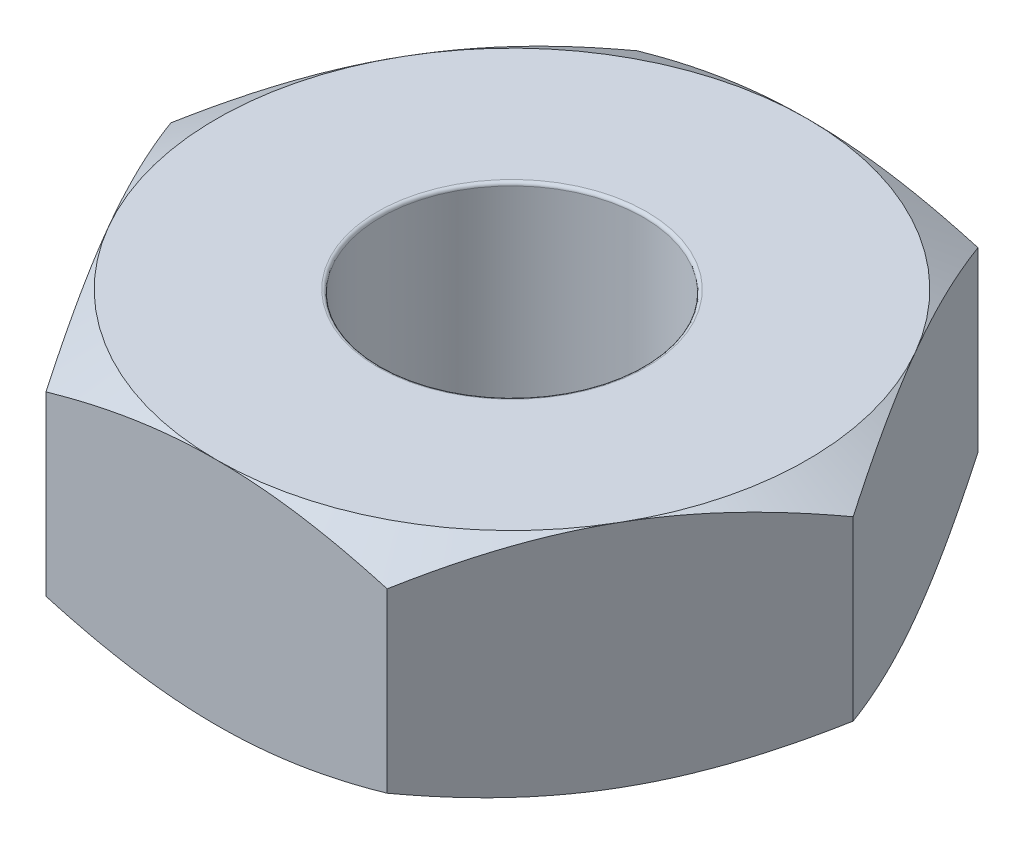
ISO-10303-21;
HEADER;
FILE_DESCRIPTION(('STEP AP214'),'2;1');
FILE_NAME('part.step','',(''),(''),'','','');
FILE_SCHEMA(('AUTOMOTIVE_DESIGN { 1 0 10303 214 1 1 1 1 }'));
ENDSEC;
DATA;
#1=APPLICATION_CONTEXT('core data for automotive mechanical design processes');
#2=APPLICATION_PROTOCOL_DEFINITION('international standard','automotive_design',2000,#1);
#3=PRODUCT_CONTEXT('',#1,'mechanical');
#4=PRODUCT('Part','Part','',(#3));
#5=PRODUCT_RELATED_PRODUCT_CATEGORY('part','',(#4));
#6=PRODUCT_DEFINITION_FORMATION('','',#4);
#7=PRODUCT_DEFINITION_CONTEXT('part definition',#1,'design');
#8=PRODUCT_DEFINITION('design','',#6,#7);
#9=PRODUCT_DEFINITION_SHAPE('','',#8);
#10=(LENGTH_UNIT() NAMED_UNIT(*) SI_UNIT(.MILLI.,.METRE.));
#11=(NAMED_UNIT(*) PLANE_ANGLE_UNIT() SI_UNIT($,.RADIAN.));
#12=(NAMED_UNIT(*) SI_UNIT($,.STERADIAN.) SOLID_ANGLE_UNIT());
#13=UNCERTAINTY_MEASURE_WITH_UNIT(LENGTH_MEASURE(1.E-05),#10,'distance_accuracy_value','');
#14=(GEOMETRIC_REPRESENTATION_CONTEXT(3) GLOBAL_UNCERTAINTY_ASSIGNED_CONTEXT((#13)) GLOBAL_UNIT_ASSIGNED_CONTEXT((#10,
#11,#12)) REPRESENTATION_CONTEXT('',''));
#15=CARTESIAN_POINT('',(0.,0.,0.));
#16=DIRECTION('',(0.,0.,1.));
#17=DIRECTION('',(1.,0.,0.));
#18=AXIS2_PLACEMENT_3D('',#15,#16,#17);
#19=CARTESIAN_POINT('',(-1.29903810567666,1.75,2.25));
#20=DIRECTION('',(0.,0.,-1.));
#21=DIRECTION('',(-1.,0.,0.));
#22=AXIS2_PLACEMENT_3D('',#19,#20,#21);
#23=PLANE('',#22);
#24=CARTESIAN_POINT('',(4.42213047046897,1.56555831138049,2.25));
#25=CARTESIAN_POINT('',(4.31907609605377,1.51253641089187,2.25));
#26=CARTESIAN_POINT('',(4.21587114895435,1.45980461522268,2.25));
#27=CARTESIAN_POINT('',(4.00909136564838,1.35506687206804,2.25));
#28=CARTESIAN_POINT('',(3.90551652251669,1.30306093826251,2.25));
#29=CARTESIAN_POINT('',(3.69776226755876,1.19983819414006,2.25));
#30=CARTESIAN_POINT('',(3.59358214386062,1.14862281407765,2.25));
#31=CARTESIAN_POINT('',(3.38469686395628,1.04726863927474,2.25));
#32=CARTESIAN_POINT('',(3.27999170029052,0.99712985988396,2.25));
#33=CARTESIAN_POINT('',(3.06443773664851,0.895590975392253,2.25));
#34=CARTESIAN_POINT('',(2.95355495083985,0.844262813896654,2.25));
#35=CARTESIAN_POINT('',(2.73093810810308,0.743488704008481,2.25));
#36=CARTESIAN_POINT('',(2.6192040743404,0.694042704613714,2.25));
#37=CARTESIAN_POINT('',(2.39476559407176,0.597606517380621,2.25));
#38=CARTESIAN_POINT('',(2.28206185948416,0.550614681662905,2.25));
#39=CARTESIAN_POINT('',(2.05535508627361,0.459779963230871,2.25));
#40=CARTESIAN_POINT('',(1.94135175083155,0.415937817282043,2.25));
#41=CARTESIAN_POINT('',(1.69318584033386,0.325629065729292,2.25));
#42=CARTESIAN_POINT('',(1.55875423344574,0.279891243493501,2.25));
#43=CARTESIAN_POINT('',(1.28751781965287,0.196186335346582,2.25));
#44=CARTESIAN_POINT('',(1.15071425647396,0.158215303092898,2.25));
#45=CARTESIAN_POINT('',(0.877191892519574,0.0934100246854137,2.25));
#46=CARTESIAN_POINT('',(0.740521481245889,0.0663767276583868,2.25));
#47=CARTESIAN_POINT('',(0.465223193243968,0.0252694807344895,2.25));
#48=CARTESIAN_POINT('',(0.326596509361763,0.0111879530299651,2.25));
#49=CARTESIAN_POINT('',(0.117223951792123,0.00112514059449677,2.25));
#50=CARTESIAN_POINT('',(0.0467155663666323,-0.000357653579398618,2.25));
#51=CARTESIAN_POINT('',(-0.0942778450423088,0.000502767822567364,2.25));
#52=CARTESIAN_POINT('',(-0.164762871015703,0.00284598504344043,2.25));
#53=CARTESIAN_POINT('',(-0.375901114139417,0.0155320953718868,2.25));
#54=CARTESIAN_POINT('',(-0.516240180351076,0.0315313215434624,2.25));
#55=CARTESIAN_POINT('',(-0.7975364312409,0.0769275866035957,2.25));
#56=CARTESIAN_POINT('',(-0.938448674669499,0.106589144783227,2.25));
#57=CARTESIAN_POINT('',(-1.21767236088611,0.176240629866024,2.25));
#58=CARTESIAN_POINT('',(-1.35598300406735,0.21623367827223,2.25));
#59=CARTESIAN_POINT('',(-1.62417819674141,0.301848870671622,2.25));
#60=CARTESIAN_POINT('',(-1.75416736002763,0.347149960587631,2.25));
#61=CARTESIAN_POINT('',(-2.01228919589808,0.442801523101071,2.25));
#62=CARTESIAN_POINT('',(-2.14042141743363,0.49315319970967,2.25));
#63=CARTESIAN_POINT('',(-2.39528540480934,0.597611255264982,2.25));
#64=CARTESIAN_POINT('',(-2.52201561679053,0.651721394221922,2.25));
#65=CARTESIAN_POINT('',(-2.77426151692868,0.762705830640599,2.25));
#66=CARTESIAN_POINT('',(-2.89977713920496,0.819580277044826,2.25));
#67=CARTESIAN_POINT('',(-3.14277870156181,0.932150499113664,2.25));
#68=CARTESIAN_POINT('',(-3.26031797968369,0.987731600848742,2.25));
#69=CARTESIAN_POINT('',(-3.49469938792213,1.10035122751633,2.25));
#70=CARTESIAN_POINT('',(-3.61154149542992,1.15738979940018,2.25));
#71=CARTESIAN_POINT('',(-3.84427750639044,1.27243073348915,2.25));
#72=CARTESIAN_POINT('',(-3.96017325620989,1.33042936901701,2.25));
#73=CARTESIAN_POINT('',(-4.19148501960206,1.44735195230743,2.25));
#74=CARTESIAN_POINT('',(-4.30690107318009,1.5062758208671,2.25));
#75=CARTESIAN_POINT('',(-4.42213047046897,1.56555831138049,2.25));
#76=B_SPLINE_CURVE_WITH_KNOTS('',3,(#24,#25,#26,#27,#28,#29,#30,#31,#32,#33,#34,#35,#36,#37,#38,
#39,#40,#41,#42,#43,#44,#45,#46,#47,#48,#49,#50,#51,#52,#53,#54,#55,#56,#57,#58,#59,#60,#61,#62,
#63,#64,#65,#66,#67,#68,#69,#70,#71,#72,#73,#74,#75),.UNSPECIFIED.,.F.,.F.,(4,2,2,2,2,2,2,2,2,2,
2,2,2,2,2,2,2,2,2,2,2,2,2,2,2,4),(0.,0.347684660648866,0.69537586509188,1.04363591220691,
1.39190092137216,1.75844707629515,2.12498329159302,2.4912701408257,2.85764239361152,
3.28347290105065,3.70908650157083,4.12656251242164,4.54379411118025,4.75527202620087,
4.96675003214744,5.38969802732589,5.82120323135265,6.25283896092085,6.66567429964863,
7.07860828930034,7.49196150428248,7.90533701571904,8.29537955819919,8.68543468149341,
9.07422449696779,9.46298121030579),.UNSPECIFIED.);
#77=CARTESIAN_POINT('',(1.29903810567666,0.200961894323341,2.25));
#78=VERTEX_POINT('',#77);
#79=CARTESIAN_POINT('',(0.,0.,2.25));
#80=VERTEX_POINT('',#79);
#81=EDGE_CURVE('E134',#78,#80,#76,.T.);
#82=ORIENTED_EDGE('',*,*,#81,.F.);
#83=DIRECTION('',(0.,-1.,0.));
#84=VECTOR('',#83,1.);
#85=CARTESIAN_POINT('',(1.29903810567666,1.75,2.25));
#86=LINE('',#85,#84);
#87=CARTESIAN_POINT('',(1.29903810567666,1.54903810567666,2.25));
#88=VERTEX_POINT('',#87);
#89=EDGE_CURVE('E240',#88,#78,#86,.T.);
#90=ORIENTED_EDGE('',*,*,#89,.F.);
#91=CARTESIAN_POINT('',(-4.42213047046897,0.18444168861951,2.25));
#92=CARTESIAN_POINT('',(-4.31907609605377,0.237463589108124,2.25));
#93=CARTESIAN_POINT('',(-4.21587114895435,0.290195384777318,2.25));
#94=CARTESIAN_POINT('',(-4.00909136564838,0.394933127931958,2.25));
#95=CARTESIAN_POINT('',(-3.90551652251669,0.446939061737492,2.25));
#96=CARTESIAN_POINT('',(-3.69776226755876,0.550161805859937,2.25));
#97=CARTESIAN_POINT('',(-3.59358214386062,0.601377185922348,2.25));
#98=CARTESIAN_POINT('',(-3.38469686395628,0.702731360725255,2.25));
#99=CARTESIAN_POINT('',(-3.27999170029052,0.752870140116039,2.25));
#100=CARTESIAN_POINT('',(-3.06443773664851,0.854409024607745,2.25));
#101=CARTESIAN_POINT('',(-2.95355495083985,0.905737186103345,2.25));
#102=CARTESIAN_POINT('',(-2.73093810810308,1.00651129599152,2.25));
#103=CARTESIAN_POINT('',(-2.6192040743404,1.05595729538628,2.25));
#104=CARTESIAN_POINT('',(-2.39476559407176,1.15239348261938,2.25));
#105=CARTESIAN_POINT('',(-2.28206185948416,1.19938531833709,2.25));
#106=CARTESIAN_POINT('',(-2.05535508627361,1.29022003676913,2.25));
#107=CARTESIAN_POINT('',(-1.94135175083155,1.33406218271796,2.25));
#108=CARTESIAN_POINT('',(-1.69318584033386,1.42437093427071,2.25));
#109=CARTESIAN_POINT('',(-1.55875423344575,1.4701087565065,2.25));
#110=CARTESIAN_POINT('',(-1.28751781965287,1.55381366465342,2.25));
#111=CARTESIAN_POINT('',(-1.15071425647396,1.5917846969071,2.25));
#112=CARTESIAN_POINT('',(-0.877191892519574,1.65658997531459,2.25));
#113=CARTESIAN_POINT('',(-0.740521481245888,1.68362327234161,2.25));
#114=CARTESIAN_POINT('',(-0.465223193243968,1.72473051926551,2.25));
#115=CARTESIAN_POINT('',(-0.326596509361763,1.73881204697003,2.25));
#116=CARTESIAN_POINT('',(-0.117223951792123,1.7488748594055,2.25));
#117=CARTESIAN_POINT('',(-0.0467155663666326,1.7503576535794,2.25));
#118=CARTESIAN_POINT('',(0.0942778450423085,1.74949723217743,2.25));
#119=CARTESIAN_POINT('',(0.164762871015703,1.74715401495656,2.25));
#120=CARTESIAN_POINT('',(0.375901114139417,1.73446790462811,2.25));
#121=CARTESIAN_POINT('',(0.516240180351076,1.71846867845654,2.25));
#122=CARTESIAN_POINT('',(0.797536431240901,1.6730724133964,2.25));
#123=CARTESIAN_POINT('',(0.938448674669499,1.64341085521677,2.25));
#124=CARTESIAN_POINT('',(1.21767236088611,1.57375937013398,2.25));
#125=CARTESIAN_POINT('',(1.35598300406735,1.53376632172777,2.25));
#126=CARTESIAN_POINT('',(1.62417819674141,1.44815112932838,2.25));
#127=CARTESIAN_POINT('',(1.75416736002763,1.40285003941237,2.25));
#128=CARTESIAN_POINT('',(2.01228919589808,1.30719847689893,2.25));
#129=CARTESIAN_POINT('',(2.14042141743363,1.25684680029033,2.25));
#130=CARTESIAN_POINT('',(2.39528540480934,1.15238874473502,2.25));
#131=CARTESIAN_POINT('',(2.52201561679053,1.09827860577808,2.25));
#132=CARTESIAN_POINT('',(2.77426151692868,0.987294169359401,2.25));
#133=CARTESIAN_POINT('',(2.89977713920496,0.930419722955175,2.25));
#134=CARTESIAN_POINT('',(3.14277870156182,0.817849500886336,2.25));
#135=CARTESIAN_POINT('',(3.26031797968369,0.762268399151258,2.25));
#136=CARTESIAN_POINT('',(3.49469938792213,0.649648772483666,2.25));
#137=CARTESIAN_POINT('',(3.61154149542992,0.592610200599822,2.25));
#138=CARTESIAN_POINT('',(3.84427750639044,0.477569266510854,2.25));
#139=CARTESIAN_POINT('',(3.96017325620989,0.419570630982988,2.25));
#140=CARTESIAN_POINT('',(4.19148501960206,0.302648047692571,2.25));
#141=CARTESIAN_POINT('',(4.30690107318009,0.243724179132899,2.25));
#142=CARTESIAN_POINT('',(4.42213047046897,0.184441688619512,2.25));
#143=B_SPLINE_CURVE_WITH_KNOTS('',3,(#91,#92,#93,#94,#95,#96,#97,#98,#99,#100,#101,#102,#103,
#104,#105,#106,#107,#108,#109,#110,#111,#112,#113,#114,#115,#116,#117,#118,#119,#120,#121,#122,
#123,#124,#125,#126,#127,#128,#129,#130,#131,#132,#133,#134,#135,#136,#137,#138,#139,#140,#141,
#142),.UNSPECIFIED.,.F.,.F.,(4,2,2,2,2,2,2,2,2,2,2,2,2,2,2,2,2,2,2,2,2,2,2,2,2,4),(0.,
0.347684660648864,0.695375865091879,1.04363591220691,1.39190092137216,1.75844707629514,
2.12498329159302,2.4912701408257,2.85764239361152,3.28347290105065,3.70908650157083,
4.12656251242164,4.54379411118024,4.75527202620086,4.96675003214744,5.38969802732589,
5.82120323135264,6.25283896092085,6.66567429964863,7.07860828930034,7.49196150428248,
7.90533701571904,8.29537955819919,8.68543468149341,9.07422449696779,9.46298121030579),.UNSPECIFIED.);
#144=CARTESIAN_POINT('',(0.,1.75,2.25));
#145=VERTEX_POINT('',#144);
#146=EDGE_CURVE('E381',#145,#88,#143,.T.);
#147=ORIENTED_EDGE('',*,*,#146,.F.);
#148=CARTESIAN_POINT('',(-1.29903810567666,1.54903810567666,2.25));
#149=VERTEX_POINT('',#148);
#150=EDGE_CURVE('E370',#149,#145,#143,.T.);
#151=ORIENTED_EDGE('',*,*,#150,.F.);
#152=DIRECTION('',(0.,-1.,0.));
#153=VECTOR('',#152,1.);
#154=CARTESIAN_POINT('',(-1.29903810567666,1.75,2.25));
#155=LINE('',#154,#153);
#156=CARTESIAN_POINT('',(-1.29903810567666,0.200961894323342,2.25));
#157=VERTEX_POINT('',#156);
#158=EDGE_CURVE('E168',#149,#157,#155,.T.);
#159=ORIENTED_EDGE('',*,*,#158,.T.);
#160=EDGE_CURVE('E147',#80,#157,#76,.T.);
#161=ORIENTED_EDGE('',*,*,#160,.F.);
#162=EDGE_LOOP('',(#82,#90,#147,#151,#159,#161));
#163=FACE_BOUND('',#162,.T.);
#164=ADVANCED_FACE('F45',(#163),#23,.F.);
#165=CARTESIAN_POINT('',(1.29903810567666,1.75,2.25));
#166=DIRECTION('',(-0.866025403784439,0.,-0.5));
#167=DIRECTION('',(-0.5,0.,0.866025403784439));
#168=AXIS2_PLACEMENT_3D('',#165,#166,#167);
#169=PLANE('',#168);
#170=CARTESIAN_POINT('',(2.59819168140715,0.201028565434254,-0.000200000000000624));
#171=CARTESIAN_POINT('',(2.54110487518745,0.168055578047863,0.0986772488143566));
#172=CARTESIAN_POINT('',(2.48352530077259,0.138067535415598,0.198407997179093));
#173=CARTESIAN_POINT('',(2.36736904128969,0.0857223882308777,0.399596540220632));
#174=CARTESIAN_POINT('',(2.30879029184485,0.0633838027064785,0.501057910502945));
#175=CARTESIAN_POINT('',(2.19235878855587,0.0286095576734187,0.702723189801078));
#176=CARTESIAN_POINT('',(2.13452395210774,0.0159424738337182,0.802896064976672));
#177=CARTESIAN_POINT('',(2.01858206013295,0.000818907417418583,1.00371331260268));
#178=CARTESIAN_POINT('',(1.96047542619893,-0.00165009697600185,1.1043569548332));
#179=CARTESIAN_POINT('',(1.85189419470646,0.00347837463602903,1.29242516452656));
#180=CARTESIAN_POINT('',(1.8014033667339,0.00981663451512017,1.37987784389126));
#181=CARTESIAN_POINT('',(1.70075066794718,0.029907657189889,1.55421343210877));
#182=CARTESIAN_POINT('',(1.65058914543304,0.0436672872310834,1.64109573768829));
#183=CARTESIAN_POINT('',(1.54972881521059,0.0780662653506652,1.81579095410174));
#184=CARTESIAN_POINT('',(1.49904277704711,0.0988514715826553,1.90358174743525));
#185=CARTESIAN_POINT('',(1.39842679703037,0.146026087362979,2.07785373687759));
#186=CARTESIAN_POINT('',(1.34849556551251,0.172404408014302,2.164337166751));
#187=CARTESIAN_POINT('',(1.29892263562282,0.201028565434254,2.2502));
#188=B_SPLINE_CURVE_WITH_KNOTS('',3,(#170,#171,#172,#173,#174,#175,#176,#177,#178,#179,#180,
#181,#182,#183,#184,#185,#186,#187),.UNSPECIFIED.,.F.,.F.,(4,2,2,2,2,2,2,2,4),(0.,
0.356658826016552,0.714175103224236,1.06284241804968,1.41108149062516,1.71433394539794,
2.01786749258222,2.32813511279245,2.63779325460359),.UNSPECIFIED.);
#189=CARTESIAN_POINT('',(2.59807621135332,0.200961894323341,0.));
#190=VERTEX_POINT('',#189);
#191=CARTESIAN_POINT('',(1.94855715851499,0.,1.125));
#192=VERTEX_POINT('',#191);
#193=EDGE_CURVE('E60',#190,#192,#188,.T.);
#194=ORIENTED_EDGE('',*,*,#193,.F.);
#195=DIRECTION('',(0.,-1.,0.));
#196=VECTOR('',#195,1.);
#197=CARTESIAN_POINT('',(2.59807621135332,1.75,0.));
#198=LINE('',#197,#196);
#199=CARTESIAN_POINT('',(2.59807621135332,1.54903810567666,0.));
#200=VERTEX_POINT('',#199);
#201=EDGE_CURVE('E373',#200,#190,#198,.T.);
#202=ORIENTED_EDGE('',*,*,#201,.F.);
#203=CARTESIAN_POINT('',(1.29892263562282,1.54897143456575,2.2502));
#204=CARTESIAN_POINT('',(1.35600944184252,1.58194442195214,2.15132275118564));
#205=CARTESIAN_POINT('',(1.41358901625738,1.6119324645844,2.05159200282091));
#206=CARTESIAN_POINT('',(1.52974527574028,1.66427761176912,1.85040345977937));
#207=CARTESIAN_POINT('',(1.58832402518512,1.68661619729352,1.74894208949705));
#208=CARTESIAN_POINT('',(1.7047555284741,1.72139044232658,1.54727681019892));
#209=CARTESIAN_POINT('',(1.76259036492223,1.73405752616628,1.44710393502333));
#210=CARTESIAN_POINT('',(1.87853225689702,1.74918109258258,1.24628668739732));
#211=CARTESIAN_POINT('',(1.93663889083104,1.751650096976,1.1456430451668));
#212=CARTESIAN_POINT('',(2.04522012232352,1.74652162536397,0.957574835473435));
#213=CARTESIAN_POINT('',(2.09571095029608,1.74018336548488,0.870122156108742));
#214=CARTESIAN_POINT('',(2.19636364908279,1.72009234281011,0.695786567891226));
#215=CARTESIAN_POINT('',(2.24652517159694,1.70633271276892,0.608904262311712));
#216=CARTESIAN_POINT('',(2.34738550181938,1.67193373464934,0.434209045898264));
#217=CARTESIAN_POINT('',(2.39807153998286,1.65114852841734,0.346418252564747));
#218=CARTESIAN_POINT('',(2.49868751999961,1.60397391263702,0.172146263122405));
#219=CARTESIAN_POINT('',(2.54861875151746,1.5775955919857,0.0856628332489975));
#220=CARTESIAN_POINT('',(2.59819168140715,1.54897143456575,-0.000200000000000289));
#221=B_SPLINE_CURVE_WITH_KNOTS('',3,(#203,#204,#205,#206,#207,#208,#209,#210,#211,#212,#213,
#214,#215,#216,#217,#218,#219,#220),.UNSPECIFIED.,.F.,.F.,(4,2,2,2,2,2,2,2,4),(0.,
0.356658826016553,0.714175103224236,1.06284241804968,1.41108149062516,1.71433394539794,
2.01786749258222,2.32813511279245,2.63779325460359),.UNSPECIFIED.);
#222=CARTESIAN_POINT('',(1.94855715851499,1.75,1.125));
#223=VERTEX_POINT('',#222);
#224=EDGE_CURVE('E280',#223,#200,#221,.T.);
#225=ORIENTED_EDGE('',*,*,#224,.F.);
#226=EDGE_CURVE('E380',#88,#223,#221,.T.);
#227=ORIENTED_EDGE('',*,*,#226,.F.);
#228=ORIENTED_EDGE('',*,*,#89,.T.);
#229=EDGE_CURVE('E141',#192,#78,#188,.T.);
#230=ORIENTED_EDGE('',*,*,#229,.F.);
#231=EDGE_LOOP('',(#194,#202,#225,#227,#228,#230));
#232=FACE_BOUND('',#231,.T.);
#233=ADVANCED_FACE('F265',(#232),#169,.F.);
#234=CARTESIAN_POINT('',(2.59807621135332,1.75,0.));
#235=DIRECTION('',(-0.866025403784439,0.,0.5));
#236=DIRECTION('',(0.5,0.,0.866025403784439));
#237=AXIS2_PLACEMENT_3D('',#234,#235,#236);
#238=PLANE('',#237);
#239=CARTESIAN_POINT('',(1.29892263562282,0.201028565434255,-2.2502));
#240=CARTESIAN_POINT('',(1.35600944184252,0.168055578047864,-2.15132275118564));
#241=CARTESIAN_POINT('',(1.41358901625738,0.138067535415598,-2.05159200282091));
#242=CARTESIAN_POINT('',(1.52974527574028,0.0857223882308782,-1.85040345977937));
#243=CARTESIAN_POINT('',(1.58832402518513,0.063383802706479,-1.74894208949706));
#244=CARTESIAN_POINT('',(1.7047555284741,0.0286095576734191,-1.54727681019892));
#245=CARTESIAN_POINT('',(1.76259036492223,0.0159424738337186,-1.44710393502333));
#246=CARTESIAN_POINT('',(1.87853225689702,0.000818907417419044,-1.24628668739732));
#247=CARTESIAN_POINT('',(1.93663889083104,-0.00165009697600135,-1.1456430451668));
#248=CARTESIAN_POINT('',(2.04522012232352,0.00347837463602929,-0.957574835473436));
#249=CARTESIAN_POINT('',(2.09571095029608,0.00981663451512019,-0.870122156108743));
#250=CARTESIAN_POINT('',(2.19636364908279,0.0299076571898888,-0.695786567891227));
#251=CARTESIAN_POINT('',(2.24652517159694,0.0436672872310834,-0.608904262311712));
#252=CARTESIAN_POINT('',(2.34738550181938,0.0780662653506654,-0.434209045898265));
#253=CARTESIAN_POINT('',(2.39807153998286,0.0988514715826554,-0.346418252564747));
#254=CARTESIAN_POINT('',(2.49868751999961,0.146026087362979,-0.172146263122406));
#255=CARTESIAN_POINT('',(2.54861875151746,0.172404408014302,-0.0856628332489984));
#256=CARTESIAN_POINT('',(2.59819168140715,0.201028565434254,0.000199999999999363));
#257=B_SPLINE_CURVE_WITH_KNOTS('',3,(#239,#240,#241,#242,#243,#244,#245,#246,#247,#248,#249,
#250,#251,#252,#253,#254,#255,#256),.UNSPECIFIED.,.F.,.F.,(4,2,2,2,2,2,2,2,4),(0.,
0.356658826016552,0.714175103224236,1.06284241804968,1.41108149062516,1.71433394539794,
2.01786749258222,2.32813511279245,2.63779325460359),.UNSPECIFIED.);
#258=CARTESIAN_POINT('',(1.29903810567667,0.200961894323335,-2.25));
#259=VERTEX_POINT('',#258);
#260=CARTESIAN_POINT('',(1.94855715851499,0.,-1.125));
#261=VERTEX_POINT('',#260);
#262=EDGE_CURVE('E68',#259,#261,#257,.T.);
#263=ORIENTED_EDGE('',*,*,#262,.F.);
#264=DIRECTION('',(0.,-1.,0.));
#265=VECTOR('',#264,1.);
#266=CARTESIAN_POINT('',(1.29903810567666,1.75,-2.25));
#267=LINE('',#266,#265);
#268=CARTESIAN_POINT('',(1.29903810567666,1.54903810567666,-2.25));
#269=VERTEX_POINT('',#268);
#270=EDGE_CURVE('E368',#269,#259,#267,.T.);
#271=ORIENTED_EDGE('',*,*,#270,.F.);
#272=CARTESIAN_POINT('',(2.59819168140715,1.54897143456575,0.000199999999999422));
#273=CARTESIAN_POINT('',(2.54110487518745,1.58194442195214,-0.0986772488143579));
#274=CARTESIAN_POINT('',(2.48352530077259,1.6119324645844,-0.198407997179094));
#275=CARTESIAN_POINT('',(2.36736904128969,1.66427761176912,-0.399596540220633));
#276=CARTESIAN_POINT('',(2.30879029184485,1.68661619729352,-0.501057910502946));
#277=CARTESIAN_POINT('',(2.19235878855587,1.72139044232658,-0.702723189801079));
#278=CARTESIAN_POINT('',(2.13452395210774,1.73405752616628,-0.802896064976673));
#279=CARTESIAN_POINT('',(2.01858206013295,1.74918109258258,-1.00371331260268));
#280=CARTESIAN_POINT('',(1.96047542619893,1.751650096976,-1.1043569548332));
#281=CARTESIAN_POINT('',(1.85189419470646,1.74652162536397,-1.29242516452657));
#282=CARTESIAN_POINT('',(1.8014033667339,1.74018336548488,-1.37987784389126));
#283=CARTESIAN_POINT('',(1.70075066794718,1.72009234281011,-1.55421343210877));
#284=CARTESIAN_POINT('',(1.65058914543304,1.70633271276892,-1.64109573768829));
#285=CARTESIAN_POINT('',(1.54972881521059,1.67193373464933,-1.81579095410174));
#286=CARTESIAN_POINT('',(1.49904277704711,1.65114852841734,-1.90358174743525));
#287=CARTESIAN_POINT('',(1.39842679703037,1.60397391263702,-2.0778537368776));
#288=CARTESIAN_POINT('',(1.34849556551251,1.5775955919857,-2.164337166751));
#289=CARTESIAN_POINT('',(1.29892263562282,1.54897143456575,-2.2502));
#290=B_SPLINE_CURVE_WITH_KNOTS('',3,(#272,#273,#274,#275,#276,#277,#278,#279,#280,#281,#282,
#283,#284,#285,#286,#287,#288,#289),.UNSPECIFIED.,.F.,.F.,(4,2,2,2,2,2,2,2,4),(0.,
0.356658826016552,0.714175103224236,1.06284241804968,1.41108149062516,1.71433394539794,
2.01786749258222,2.32813511279245,2.63779325460359),.UNSPECIFIED.);
#291=CARTESIAN_POINT('',(1.94855715851499,1.75,-1.125));
#292=VERTEX_POINT('',#291);
#293=EDGE_CURVE('E329',#292,#269,#290,.T.);
#294=ORIENTED_EDGE('',*,*,#293,.F.);
#295=EDGE_CURVE('E387',#200,#292,#290,.T.);
#296=ORIENTED_EDGE('',*,*,#295,.F.);
#297=ORIENTED_EDGE('',*,*,#201,.T.);
#298=EDGE_CURVE('E206',#261,#190,#257,.T.);
#299=ORIENTED_EDGE('',*,*,#298,.F.);
#300=EDGE_LOOP('',(#263,#271,#294,#296,#297,#299));
#301=FACE_BOUND('',#300,.T.);
#302=ADVANCED_FACE('F269',(#301),#238,.F.);
#303=CARTESIAN_POINT('',(1.29903810567666,1.75,-2.25));
#304=DIRECTION('',(0.,0.,1.));
#305=DIRECTION('',(1.,0.,0.));
#306=AXIS2_PLACEMENT_3D('',#303,#304,#305);
#307=PLANE('',#306);
#308=CARTESIAN_POINT('',(-4.42213047046897,1.56555831138049,-2.25));
#309=CARTESIAN_POINT('',(-4.31907609605377,1.51253641089187,-2.25));
#310=CARTESIAN_POINT('',(-4.21587114895435,1.45980461522268,-2.25));
#311=CARTESIAN_POINT('',(-4.00909136564838,1.35506687206804,-2.25));
#312=CARTESIAN_POINT('',(-3.90551652251669,1.30306093826251,-2.25));
#313=CARTESIAN_POINT('',(-3.69776226755876,1.19983819414006,-2.25));
#314=CARTESIAN_POINT('',(-3.59358214386062,1.14862281407765,-2.25));
#315=CARTESIAN_POINT('',(-3.38469686395628,1.04726863927474,-2.25));
#316=CARTESIAN_POINT('',(-3.27999170029052,0.997129859883961,-2.25));
#317=CARTESIAN_POINT('',(-3.06443773664851,0.895590975392253,-2.25));
#318=CARTESIAN_POINT('',(-2.95355495083985,0.844262813896654,-2.25));
#319=CARTESIAN_POINT('',(-2.73093810810308,0.743488704008481,-2.25));
#320=CARTESIAN_POINT('',(-2.6192040743404,0.694042704613714,-2.25));
#321=CARTESIAN_POINT('',(-2.39476559407176,0.59760651738062,-2.25));
#322=CARTESIAN_POINT('',(-2.28206185948416,0.550614681662905,-2.25));
#323=CARTESIAN_POINT('',(-2.05535508627361,0.459779963230871,-2.25));
#324=CARTESIAN_POINT('',(-1.94135175083155,0.415937817282044,-2.25));
#325=CARTESIAN_POINT('',(-1.69318584033386,0.325629065729293,-2.25));
#326=CARTESIAN_POINT('',(-1.55875423344575,0.279891243493501,-2.25));
#327=CARTESIAN_POINT('',(-1.28751781965287,0.196186335346582,-2.25));
#328=CARTESIAN_POINT('',(-1.15071425647396,0.158215303092899,-2.25));
#329=CARTESIAN_POINT('',(-0.877191892519576,0.0934100246854139,-2.25));
#330=CARTESIAN_POINT('',(-0.74052148124589,0.0663767276583869,-2.25));
#331=CARTESIAN_POINT('',(-0.46522319324397,0.0252694807344893,-2.25));
#332=CARTESIAN_POINT('',(-0.326596509361765,0.0111879530299646,-2.25));
#333=CARTESIAN_POINT('',(-0.117223951792124,0.00112514059449649,-2.25));
#334=CARTESIAN_POINT('',(-0.046715566366634,-0.000357653579398756,-2.25));
#335=CARTESIAN_POINT('',(0.0942778450423068,0.000502767822567245,-2.25));
#336=CARTESIAN_POINT('',(0.164762871015701,0.00284598504344017,-2.25));
#337=CARTESIAN_POINT('',(0.375901114139415,0.0155320953718862,-2.25));
#338=CARTESIAN_POINT('',(0.516240180351074,0.0315313215434617,-2.25));
#339=CARTESIAN_POINT('',(0.797536431240898,0.0769275866035949,-2.25));
#340=CARTESIAN_POINT('',(0.938448674669497,0.106589144783226,-2.25));
#341=CARTESIAN_POINT('',(1.21767236088611,0.176240629866023,-2.25));
#342=CARTESIAN_POINT('',(1.35598300406735,0.216233678272229,-2.25));
#343=CARTESIAN_POINT('',(1.62417819674141,0.301848870671621,-2.25));
#344=CARTESIAN_POINT('',(1.75416736002763,0.34714996058763,-2.25));
#345=CARTESIAN_POINT('',(2.01228919589808,0.44280152310107,-2.25));
#346=CARTESIAN_POINT('',(2.14042141743363,0.493153199709669,-2.25));
#347=CARTESIAN_POINT('',(2.39528540480934,0.597611255264982,-2.25));
#348=CARTESIAN_POINT('',(2.52201561679053,0.651721394221922,-2.25));
#349=CARTESIAN_POINT('',(2.77426151692868,0.762705830640599,-2.25));
#350=CARTESIAN_POINT('',(2.89977713920496,0.819580277044825,-2.25));
#351=CARTESIAN_POINT('',(3.14277870156182,0.932150499113664,-2.25));
#352=CARTESIAN_POINT('',(3.26031797968369,0.987731600848742,-2.25));
#353=CARTESIAN_POINT('',(3.49469938792213,1.10035122751633,-2.25));
#354=CARTESIAN_POINT('',(3.61154149542992,1.15738979940018,-2.25));
#355=CARTESIAN_POINT('',(3.84427750639044,1.27243073348915,-2.25));
#356=CARTESIAN_POINT('',(3.96017325620989,1.33042936901701,-2.25));
#357=CARTESIAN_POINT('',(4.19148501960206,1.44735195230743,-2.25));
#358=CARTESIAN_POINT('',(4.30690107318009,1.5062758208671,-2.25));
#359=CARTESIAN_POINT('',(4.42213047046897,1.56555831138049,-2.25));
#360=B_SPLINE_CURVE_WITH_KNOTS('',3,(#308,#309,#310,#311,#312,#313,#314,#315,#316,#317,#318,
#319,#320,#321,#322,#323,#324,#325,#326,#327,#328,#329,#330,#331,#332,#333,#334,#335,#336,#337,
#338,#339,#340,#341,#342,#343,#344,#345,#346,#347,#348,#349,#350,#351,#352,#353,#354,#355,#356,
#357,#358,#359),.UNSPECIFIED.,.F.,.F.,(4,2,2,2,2,2,2,2,2,2,2,2,2,2,2,2,2,2,2,2,2,2,2,2,2,4),(0.,
0.347684660648864,0.695375865091879,1.04363591220691,1.39190092137216,1.75844707629515,
2.12498329159303,2.4912701408257,2.85764239361152,3.28347290105065,3.70908650157083,
4.12656251242163,4.54379411118024,4.75527202620086,4.96675003214744,5.38969802732589,
5.82120323135264,6.25283896092085,6.66567429964863,7.07860828930034,7.49196150428248,
7.90533701571904,8.29537955819919,8.68543468149341,9.07422449696778,9.46298121030578),.UNSPECIFIED.);
#361=CARTESIAN_POINT('',(-1.29903810567666,0.200961894323341,-2.25));
#362=VERTEX_POINT('',#361);
#363=CARTESIAN_POINT('',(0.,0.,-2.25));
#364=VERTEX_POINT('',#363);
#365=EDGE_CURVE('E184',#362,#364,#360,.T.);
#366=ORIENTED_EDGE('',*,*,#365,.F.);
#367=DIRECTION('',(0.,-1.,0.));
#368=VECTOR('',#367,1.);
#369=CARTESIAN_POINT('',(-1.29903810567666,1.75,-2.25));
#370=LINE('',#369,#368);
#371=CARTESIAN_POINT('',(-1.29903810567666,1.54903810567666,-2.25));
#372=VERTEX_POINT('',#371);
#373=EDGE_CURVE('E336',#372,#362,#370,.T.);
#374=ORIENTED_EDGE('',*,*,#373,.F.);
#375=CARTESIAN_POINT('',(4.42213047046897,0.184441688619511,-2.25));
#376=CARTESIAN_POINT('',(4.31907609605377,0.237463589108125,-2.25));
#377=CARTESIAN_POINT('',(4.21587114895435,0.290195384777319,-2.25));
#378=CARTESIAN_POINT('',(4.00909136564838,0.394933127931959,-2.25));
#379=CARTESIAN_POINT('',(3.90551652251669,0.446939061737493,-2.25));
#380=CARTESIAN_POINT('',(3.69776226755876,0.550161805859938,-2.25));
#381=CARTESIAN_POINT('',(3.59358214386062,0.601377185922349,-2.25));
#382=CARTESIAN_POINT('',(3.38469686395628,0.702731360725255,-2.25));
#383=CARTESIAN_POINT('',(3.27999170029052,0.752870140116039,-2.25));
#384=CARTESIAN_POINT('',(3.06443773664851,0.854409024607746,-2.25));
#385=CARTESIAN_POINT('',(2.95355495083985,0.905737186103346,-2.25));
#386=CARTESIAN_POINT('',(2.73093810810308,1.00651129599152,-2.25));
#387=CARTESIAN_POINT('',(2.6192040743404,1.05595729538629,-2.25));
#388=CARTESIAN_POINT('',(2.39476559407176,1.15239348261938,-2.25));
#389=CARTESIAN_POINT('',(2.28206185948416,1.19938531833709,-2.25));
#390=CARTESIAN_POINT('',(2.05535508627361,1.29022003676913,-2.25));
#391=CARTESIAN_POINT('',(1.94135175083155,1.33406218271796,-2.25));
#392=CARTESIAN_POINT('',(1.69318584033386,1.42437093427071,-2.25));
#393=CARTESIAN_POINT('',(1.55875423344575,1.4701087565065,-2.25));
#394=CARTESIAN_POINT('',(1.28751781965287,1.55381366465342,-2.25));
#395=CARTESIAN_POINT('',(1.15071425647396,1.5917846969071,-2.25));
#396=CARTESIAN_POINT('',(0.877191892519575,1.65658997531459,-2.25));
#397=CARTESIAN_POINT('',(0.740521481245889,1.68362327234161,-2.25));
#398=CARTESIAN_POINT('',(0.465223193243969,1.72473051926551,-2.25));
#399=CARTESIAN_POINT('',(0.326596509361764,1.73881204697004,-2.25));
#400=CARTESIAN_POINT('',(0.117223951792124,1.7488748594055,-2.25));
#401=CARTESIAN_POINT('',(0.0467155663666333,1.7503576535794,-2.25));
#402=CARTESIAN_POINT('',(-0.0942778450423077,1.74949723217743,-2.25));
#403=CARTESIAN_POINT('',(-0.164762871015702,1.74715401495656,-2.25));
#404=CARTESIAN_POINT('',(-0.375901114139416,1.73446790462811,-2.25));
#405=CARTESIAN_POINT('',(-0.516240180351076,1.71846867845654,-2.25));
#406=CARTESIAN_POINT('',(-0.7975364312409,1.67307241339641,-2.25));
#407=CARTESIAN_POINT('',(-0.938448674669498,1.64341085521677,-2.25));
#408=CARTESIAN_POINT('',(-1.21767236088611,1.57375937013398,-2.25));
#409=CARTESIAN_POINT('',(-1.35598300406735,1.53376632172777,-2.25));
#410=CARTESIAN_POINT('',(-1.62417819674141,1.44815112932838,-2.25));
#411=CARTESIAN_POINT('',(-1.75416736002763,1.40285003941237,-2.25));
#412=CARTESIAN_POINT('',(-2.01228919589808,1.30719847689893,-2.25));
#413=CARTESIAN_POINT('',(-2.14042141743363,1.25684680029033,-2.25));
#414=CARTESIAN_POINT('',(-2.39528540480934,1.15238874473502,-2.25));
#415=CARTESIAN_POINT('',(-2.52201561679053,1.09827860577808,-2.25));
#416=CARTESIAN_POINT('',(-2.77426151692868,0.987294169359402,-2.25));
#417=CARTESIAN_POINT('',(-2.89977713920496,0.930419722955175,-2.25));
#418=CARTESIAN_POINT('',(-3.14277870156182,0.817849500886336,-2.25));
#419=CARTESIAN_POINT('',(-3.26031797968369,0.762268399151259,-2.25));
#420=CARTESIAN_POINT('',(-3.49469938792213,0.649648772483666,-2.25));
#421=CARTESIAN_POINT('',(-3.61154149542992,0.592610200599823,-2.25));
#422=CARTESIAN_POINT('',(-3.84427750639044,0.477569266510854,-2.25));
#423=CARTESIAN_POINT('',(-3.96017325620989,0.419570630982988,-2.25));
#424=CARTESIAN_POINT('',(-4.19148501960206,0.30264804769257,-2.25));
#425=CARTESIAN_POINT('',(-4.30690107318009,0.243724179132899,-2.25));
#426=CARTESIAN_POINT('',(-4.42213047046897,0.184441688619512,-2.25));
#427=B_SPLINE_CURVE_WITH_KNOTS('',3,(#375,#376,#377,#378,#379,#380,#381,#382,#383,#384,#385,
#386,#387,#388,#389,#390,#391,#392,#393,#394,#395,#396,#397,#398,#399,#400,#401,#402,#403,#404,
#405,#406,#407,#408,#409,#410,#411,#412,#413,#414,#415,#416,#417,#418,#419,#420,#421,#422,#423,
#424,#425,#426),.UNSPECIFIED.,.F.,.F.,(4,2,2,2,2,2,2,2,2,2,2,2,2,2,2,2,2,2,2,2,2,2,2,2,2,4),(0.,
0.347684660648866,0.695375865091879,1.04363591220691,1.39190092137216,1.75844707629514,
2.12498329159302,2.4912701408257,2.85764239361152,3.28347290105065,3.70908650157083,
4.12656251242164,4.54379411118024,4.75527202620087,4.96675003214744,5.38969802732589,
5.82120323135264,6.25283896092085,6.66567429964863,7.07860828930034,7.49196150428248,
7.90533701571904,8.29537955819919,8.68543468149341,9.07422449696779,9.46298121030578),.UNSPECIFIED.);
#428=CARTESIAN_POINT('',(0.,1.75,-2.25));
#429=VERTEX_POINT('',#428);
#430=EDGE_CURVE('E320',#429,#372,#427,.T.);
#431=ORIENTED_EDGE('',*,*,#430,.F.);
#432=EDGE_CURVE('E325',#269,#429,#427,.T.);
#433=ORIENTED_EDGE('',*,*,#432,.F.);
#434=ORIENTED_EDGE('',*,*,#270,.T.);
#435=EDGE_CURVE('E291',#364,#259,#360,.T.);
#436=ORIENTED_EDGE('',*,*,#435,.F.);
#437=EDGE_LOOP('',(#366,#374,#431,#433,#434,#436));
#438=FACE_BOUND('',#437,.T.);
#439=ADVANCED_FACE('F274',(#438),#307,.F.);
#440=CARTESIAN_POINT('',(-1.29903810567666,1.75,-2.25));
#441=DIRECTION('',(0.866025403784438,0.,0.5));
#442=DIRECTION('',(0.5,0.,-0.866025403784439));
#443=AXIS2_PLACEMENT_3D('',#440,#441,#442);
#444=PLANE('',#443);
#445=CARTESIAN_POINT('',(-2.59819168140715,0.201028565434255,0.000199999999999756));
#446=CARTESIAN_POINT('',(-2.54110487518746,0.168055578047864,-0.0986772488143578));
#447=CARTESIAN_POINT('',(-2.48352530077259,0.138067535415598,-0.198407997179094));
#448=CARTESIAN_POINT('',(-2.36736904128969,0.0857223882308782,-0.399596540220633));
#449=CARTESIAN_POINT('',(-2.30879029184485,0.0633838027064788,-0.501057910502946));
#450=CARTESIAN_POINT('',(-2.19235878855587,0.028609557673419,-0.702723189801079));
#451=CARTESIAN_POINT('',(-2.13452395210774,0.0159424738337185,-0.802896064976672));
#452=CARTESIAN_POINT('',(-2.01858206013295,0.000818907417418878,-1.00371331260268));
#453=CARTESIAN_POINT('',(-1.96047542619893,-0.00165009697600162,-1.1043569548332));
#454=CARTESIAN_POINT('',(-1.85189419470646,0.00347837463602929,-1.29242516452657));
#455=CARTESIAN_POINT('',(-1.8014033667339,0.00981663451512047,-1.37987784389126));
#456=CARTESIAN_POINT('',(-1.70075066794718,0.0299076571898891,-1.55421343210877));
#457=CARTESIAN_POINT('',(-1.65058914543304,0.0436672872310835,-1.64109573768829));
#458=CARTESIAN_POINT('',(-1.54972881521059,0.0780662653506652,-1.81579095410174));
#459=CARTESIAN_POINT('',(-1.49904277704711,0.0988514715826553,-1.90358174743525));
#460=CARTESIAN_POINT('',(-1.39842679703037,0.146026087362979,-2.07785373687759));
#461=CARTESIAN_POINT('',(-1.34849556551251,0.172404408014302,-2.164337166751));
#462=CARTESIAN_POINT('',(-1.29892263562282,0.201028565434254,-2.2502));
#463=B_SPLINE_CURVE_WITH_KNOTS('',3,(#445,#446,#447,#448,#449,#450,#451,#452,#453,#454,#455,
#456,#457,#458,#459,#460,#461,#462),.UNSPECIFIED.,.F.,.F.,(4,2,2,2,2,2,2,2,4),(0.,
0.356658826016553,0.714175103224236,1.06284241804968,1.41108149062516,1.71433394539794,
2.01786749258222,2.32813511279245,2.63779325460359),.UNSPECIFIED.);
#464=CARTESIAN_POINT('',(-2.59807621135332,0.200961894323341,0.));
#465=VERTEX_POINT('',#464);
#466=CARTESIAN_POINT('',(-1.94855715851499,0.,-1.125));
#467=VERTEX_POINT('',#466);
#468=EDGE_CURVE('E169',#465,#467,#463,.T.);
#469=ORIENTED_EDGE('',*,*,#468,.F.);
#470=DIRECTION('',(0.,-1.,0.));
#471=VECTOR('',#470,1.);
#472=CARTESIAN_POINT('',(-2.59807621135332,1.75,0.));
#473=LINE('',#472,#471);
#474=CARTESIAN_POINT('',(-2.59807621135332,1.54903810567666,0.));
#475=VERTEX_POINT('',#474);
#476=EDGE_CURVE('E362',#475,#465,#473,.T.);
#477=ORIENTED_EDGE('',*,*,#476,.F.);
#478=CARTESIAN_POINT('',(-1.29892263562282,1.54897143456575,-2.2502));
#479=CARTESIAN_POINT('',(-1.35600944184252,1.58194442195214,-2.15132275118564));
#480=CARTESIAN_POINT('',(-1.41358901625738,1.6119324645844,-2.05159200282091));
#481=CARTESIAN_POINT('',(-1.52974527574028,1.66427761176912,-1.85040345977937));
#482=CARTESIAN_POINT('',(-1.58832402518513,1.68661619729352,-1.74894208949705));
#483=CARTESIAN_POINT('',(-1.7047555284741,1.72139044232658,-1.54727681019892));
#484=CARTESIAN_POINT('',(-1.76259036492223,1.73405752616628,-1.44710393502333));
#485=CARTESIAN_POINT('',(-1.87853225689703,1.74918109258258,-1.24628668739732));
#486=CARTESIAN_POINT('',(-1.93663889083104,1.751650096976,-1.1456430451668));
#487=CARTESIAN_POINT('',(-2.04522012232352,1.74652162536397,-0.957574835473435));
#488=CARTESIAN_POINT('',(-2.09571095029608,1.74018336548488,-0.870122156108742));
#489=CARTESIAN_POINT('',(-2.19636364908279,1.72009234281011,-0.695786567891226));
#490=CARTESIAN_POINT('',(-2.24652517159694,1.70633271276892,-0.608904262311712));
#491=CARTESIAN_POINT('',(-2.34738550181938,1.67193373464933,-0.434209045898264));
#492=CARTESIAN_POINT('',(-2.39807153998286,1.65114852841734,-0.346418252564747));
#493=CARTESIAN_POINT('',(-2.49868751999961,1.60397391263702,-0.172146263122405));
#494=CARTESIAN_POINT('',(-2.54861875151746,1.5775955919857,-0.0856628332489981));
#495=CARTESIAN_POINT('',(-2.59819168140715,1.54897143456575,0.00019999999999956));
#496=B_SPLINE_CURVE_WITH_KNOTS('',3,(#478,#479,#480,#481,#482,#483,#484,#485,#486,#487,#488,
#489,#490,#491,#492,#493,#494,#495),.UNSPECIFIED.,.F.,.F.,(4,2,2,2,2,2,2,2,4),(0.,
0.356658826016552,0.714175103224236,1.06284241804968,1.41108149062516,1.71433394539794,
2.01786749258222,2.32813511279245,2.63779325460359),.UNSPECIFIED.);
#497=CARTESIAN_POINT('',(-1.94855715851499,1.75,-1.125));
#498=VERTEX_POINT('',#497);
#499=EDGE_CURVE('E307',#498,#475,#496,.T.);
#500=ORIENTED_EDGE('',*,*,#499,.F.);
#501=EDGE_CURVE('E311',#372,#498,#496,.T.);
#502=ORIENTED_EDGE('',*,*,#501,.F.);
#503=ORIENTED_EDGE('',*,*,#373,.T.);
#504=EDGE_CURVE('E146',#467,#362,#463,.T.);
#505=ORIENTED_EDGE('',*,*,#504,.F.);
#506=EDGE_LOOP('',(#469,#477,#500,#502,#503,#505));
#507=FACE_BOUND('',#506,.T.);
#508=ADVANCED_FACE('F228',(#507),#444,.F.);
#509=CARTESIAN_POINT('',(-2.59807621135332,1.75,0.));
#510=DIRECTION('',(0.866025403784439,0.,-0.5));
#511=DIRECTION('',(-0.5,0.,-0.866025403784439));
#512=AXIS2_PLACEMENT_3D('',#509,#510,#511);
#513=PLANE('',#512);
#514=CARTESIAN_POINT('',(-1.29892263562282,0.201028565434255,2.2502));
#515=CARTESIAN_POINT('',(-1.35600944184252,0.168055578047864,2.15132275118564));
#516=CARTESIAN_POINT('',(-1.41358901625738,0.138067535415599,2.05159200282091));
#517=CARTESIAN_POINT('',(-1.52974527574028,0.0857223882308787,1.85040345977937));
#518=CARTESIAN_POINT('',(-1.58832402518512,0.0633838027064794,1.74894208949706));
#519=CARTESIAN_POINT('',(-1.7047555284741,0.0286095576734192,1.54727681019892));
#520=CARTESIAN_POINT('',(-1.76259036492223,0.0159424738337184,1.44710393502333));
#521=CARTESIAN_POINT('',(-1.87853225689702,0.000818907417418923,1.24628668739732));
#522=CARTESIAN_POINT('',(-1.93663889083104,-0.00165009697600123,1.1456430451668));
#523=CARTESIAN_POINT('',(-2.04522012232352,0.00347837463602967,0.957574835473436));
#524=CARTESIAN_POINT('',(-2.09571095029608,0.00981663451512062,0.870122156108743));
#525=CARTESIAN_POINT('',(-2.19636364908279,0.0299076571898892,0.695786567891227));
#526=CARTESIAN_POINT('',(-2.24652517159694,0.0436672872310837,0.608904262311712));
#527=CARTESIAN_POINT('',(-2.34738550181938,0.0780662653506655,0.434209045898264));
#528=CARTESIAN_POINT('',(-2.39807153998286,0.0988514715826556,0.346418252564747));
#529=CARTESIAN_POINT('',(-2.49868751999961,0.14602608736298,0.172146263122405));
#530=CARTESIAN_POINT('',(-2.54861875151746,0.172404408014302,0.0856628332489976));
#531=CARTESIAN_POINT('',(-2.59819168140715,0.201028565434255,-0.000200000000000237));
#532=B_SPLINE_CURVE_WITH_KNOTS('',3,(#514,#515,#516,#517,#518,#519,#520,#521,#522,#523,#524,
#525,#526,#527,#528,#529,#530,#531),.UNSPECIFIED.,.F.,.F.,(4,2,2,2,2,2,2,2,4),(0.,
0.356658826016552,0.714175103224236,1.06284241804968,1.41108149062516,1.71433394539794,
2.01786749258222,2.32813511279245,2.6377932546036),.UNSPECIFIED.);
#533=CARTESIAN_POINT('',(-1.94855715851499,0.,1.125));
#534=VERTEX_POINT('',#533);
#535=EDGE_CURVE('E154',#157,#534,#532,.T.);
#536=ORIENTED_EDGE('',*,*,#535,.F.);
#537=ORIENTED_EDGE('',*,*,#158,.F.);
#538=CARTESIAN_POINT('',(-2.59819168140715,1.54897143456575,-0.000200000000000275));
#539=CARTESIAN_POINT('',(-2.54110487518746,1.58194442195214,0.098677248814357));
#540=CARTESIAN_POINT('',(-2.48352530077259,1.6119324645844,0.198407997179093));
#541=CARTESIAN_POINT('',(-2.36736904128969,1.66427761176912,0.399596540220632));
#542=CARTESIAN_POINT('',(-2.30879029184485,1.68661619729352,0.501057910502945));
#543=CARTESIAN_POINT('',(-2.19235878855587,1.72139044232658,0.702723189801078));
#544=CARTESIAN_POINT('',(-2.13452395210774,1.73405752616628,0.802896064976672));
#545=CARTESIAN_POINT('',(-2.01858206013295,1.74918109258258,1.00371331260268));
#546=CARTESIAN_POINT('',(-1.96047542619893,1.751650096976,1.1043569548332));
#547=CARTESIAN_POINT('',(-1.85189419470646,1.74652162536397,1.29242516452656));
#548=CARTESIAN_POINT('',(-1.8014033667339,1.74018336548488,1.37987784389126));
#549=CARTESIAN_POINT('',(-1.70075066794718,1.72009234281011,1.55421343210877));
#550=CARTESIAN_POINT('',(-1.65058914543304,1.70633271276892,1.64109573768829));
#551=CARTESIAN_POINT('',(-1.54972881521059,1.67193373464933,1.81579095410174));
#552=CARTESIAN_POINT('',(-1.49904277704711,1.65114852841734,1.90358174743525));
#553=CARTESIAN_POINT('',(-1.39842679703037,1.60397391263702,2.0778537368776));
#554=CARTESIAN_POINT('',(-1.34849556551251,1.5775955919857,2.164337166751));
#555=CARTESIAN_POINT('',(-1.29892263562282,1.54897143456574,2.2502));
#556=B_SPLINE_CURVE_WITH_KNOTS('',3,(#538,#539,#540,#541,#542,#543,#544,#545,#546,#547,#548,
#549,#550,#551,#552,#553,#554,#555),.UNSPECIFIED.,.F.,.F.,(4,2,2,2,2,2,2,2,4),(0.,
0.356658826016552,0.714175103224236,1.06284241804968,1.41108149062516,1.71433394539794,
2.01786749258222,2.32813511279245,2.6377932546036),.UNSPECIFIED.);
#557=CARTESIAN_POINT('',(-1.94855715851499,1.75,1.125));
#558=VERTEX_POINT('',#557);
#559=EDGE_CURVE('E234',#558,#149,#556,.T.);
#560=ORIENTED_EDGE('',*,*,#559,.F.);
#561=EDGE_CURVE('E159',#475,#558,#556,.T.);
#562=ORIENTED_EDGE('',*,*,#561,.F.);
#563=ORIENTED_EDGE('',*,*,#476,.T.);
#564=EDGE_CURVE('E215',#534,#465,#532,.T.);
#565=ORIENTED_EDGE('',*,*,#564,.F.);
#566=EDGE_LOOP('',(#536,#537,#560,#562,#563,#565));
#567=FACE_BOUND('',#566,.T.);
#568=ADVANCED_FACE('F224',(#567),#513,.F.);
#569=CARTESIAN_POINT('',(0.,0.,0.));
#570=DIRECTION('',(0.,1.,0.));
#571=DIRECTION('',(0.,0.,1.));
#572=AXIS2_PLACEMENT_3D('',#569,#570,#571);
#573=PLANE('',#572);
#574=CARTESIAN_POINT('',(0.,0.,0.));
#575=DIRECTION('',(0.,1.,0.));
#576=DIRECTION('',(0.,0.,1.));
#577=AXIS2_PLACEMENT_3D('',#574,#575,#576);
#578=CIRCLE('',#577,1.025);
#579=CARTESIAN_POINT('',(0.,0.,1.025));
#580=VERTEX_POINT('',#579);
#581=EDGE_CURVE('E164',#580,#580,#578,.T.);
#582=ORIENTED_EDGE('',*,*,#581,.T.);
#583=EDGE_LOOP('',(#582));
#584=FACE_BOUND('',#583,.T.);
#585=CARTESIAN_POINT('',(0.,0.,0.));
#586=DIRECTION('',(0.,1.,0.));
#587=DIRECTION('',(0.,0.,1.));
#588=AXIS2_PLACEMENT_3D('',#585,#586,#587);
#589=CIRCLE('',#588,2.25);
#590=EDGE_CURVE('E138',#80,#192,#589,.T.);
#591=ORIENTED_EDGE('',*,*,#590,.F.);
#592=EDGE_CURVE('E151',#534,#80,#589,.T.);
#593=ORIENTED_EDGE('',*,*,#592,.F.);
#594=EDGE_CURVE('E158',#467,#534,#589,.T.);
#595=ORIENTED_EDGE('',*,*,#594,.F.);
#596=EDGE_CURVE('E587',#364,#467,#589,.T.);
#597=ORIENTED_EDGE('',*,*,#596,.F.);
#598=CARTESIAN_POINT('',(0.,0.,0.));
#599=DIRECTION('',(0.,-1.,0.));
#600=DIRECTION('',(0.,0.,-1.));
#601=AXIS2_PLACEMENT_3D('',#598,#599,#600);
#602=CIRCLE('',#601,2.25);
#603=EDGE_CURVE('E223',#364,#261,#602,.T.);
#604=ORIENTED_EDGE('',*,*,#603,.T.);
#605=EDGE_CURVE('E163',#192,#261,#589,.T.);
#606=ORIENTED_EDGE('',*,*,#605,.F.);
#607=EDGE_LOOP('',(#591,#593,#595,#597,#604,#606));
#608=FACE_BOUND('',#607,.T.);
#609=ADVANCED_FACE('F161',(#584,#608),#573,.F.);
#610=CARTESIAN_POINT('',(0.,1.75,0.));
#611=DIRECTION('',(0.,1.,0.));
#612=DIRECTION('',(0.,0.,1.));
#613=AXIS2_PLACEMENT_3D('',#610,#611,#612);
#614=PLANE('',#613);
#615=CARTESIAN_POINT('',(0.,1.75,0.));
#616=DIRECTION('',(0.,1.,0.));
#617=DIRECTION('',(0.,0.,1.));
#618=AXIS2_PLACEMENT_3D('',#615,#616,#617);
#619=CIRCLE('',#618,1.025);
#620=CARTESIAN_POINT('',(0.,1.75,1.025));
#621=VERTEX_POINT('',#620);
#622=EDGE_CURVE('E12',#621,#621,#619,.F.);
#623=ORIENTED_EDGE('',*,*,#622,.T.);
#624=EDGE_LOOP('',(#623));
#625=FACE_BOUND('',#624,.T.);
#626=CARTESIAN_POINT('',(0.,1.75,0.));
#627=DIRECTION('',(0.,1.,0.));
#628=DIRECTION('',(0.,0.,1.));
#629=AXIS2_PLACEMENT_3D('',#626,#627,#628);
#630=CIRCLE('',#629,2.25);
#631=EDGE_CURVE('E297',#558,#145,#630,.T.);
#632=ORIENTED_EDGE('',*,*,#631,.T.);
#633=EDGE_CURVE('E300',#145,#223,#630,.T.);
#634=ORIENTED_EDGE('',*,*,#633,.T.);
#635=EDGE_CURVE('E308',#223,#292,#630,.T.);
#636=ORIENTED_EDGE('',*,*,#635,.T.);
#637=EDGE_CURVE('E312',#292,#429,#630,.T.);
#638=ORIENTED_EDGE('',*,*,#637,.T.);
#639=EDGE_CURVE('E305',#429,#498,#630,.T.);
#640=ORIENTED_EDGE('',*,*,#639,.T.);
#641=EDGE_CURVE('E299',#498,#558,#630,.T.);
#642=ORIENTED_EDGE('',*,*,#641,.T.);
#643=EDGE_LOOP('',(#632,#634,#636,#638,#640,#642));
#644=FACE_BOUND('',#643,.T.);
#645=ADVANCED_FACE('F259',(#625,#644),#614,.T.);
#646=CARTESIAN_POINT('',(0.,1.75,0.));
#647=DIRECTION('',(0.,-1.,0.));
#648=DIRECTION('',(0.,0.,-1.));
#649=AXIS2_PLACEMENT_3D('',#646,#647,#648);
#650=CYLINDRICAL_SURFACE('',#649,1.);
#651=CARTESIAN_POINT('',(0.,0.0250000000000001,0.));
#652=DIRECTION('',(0.,1.,0.));
#653=DIRECTION('',(0.,0.,1.));
#654=AXIS2_PLACEMENT_3D('',#651,#652,#653);
#655=CIRCLE('',#654,1.);
#656=CARTESIAN_POINT('',(0.,0.0250000000000001,1.));
#657=VERTEX_POINT('',#656);
#658=EDGE_CURVE('E53',#657,#657,#655,.F.);
#659=ORIENTED_EDGE('',*,*,#658,.T.);
#660=EDGE_LOOP('',(#659));
#661=FACE_BOUND('',#660,.T.);
#662=CARTESIAN_POINT('',(0.,1.725,0.));
#663=DIRECTION('',(0.,1.,0.));
#664=DIRECTION('',(0.,0.,1.));
#665=AXIS2_PLACEMENT_3D('',#662,#663,#664);
#666=CIRCLE('',#665,1.);
#667=CARTESIAN_POINT('',(0.,1.725,1.));
#668=VERTEX_POINT('',#667);
#669=EDGE_CURVE('E245',#668,#668,#666,.T.);
#670=ORIENTED_EDGE('',*,*,#669,.T.);
#671=EDGE_LOOP('',(#670));
#672=FACE_BOUND('',#671,.T.);
#673=ADVANCED_FACE('F250',(#661,#672),#650,.F.);
#674=CARTESIAN_POINT('',(0.,1.75,0.));
#675=DIRECTION('',(0.,-1.,0.));
#676=DIRECTION('',(0.,0.,1.));
#677=AXIS2_PLACEMENT_3D('',#674,#675,#676);
#678=CONICAL_SURFACE('',#677,2.25,1.0471975511966);
#679=ORIENTED_EDGE('',*,*,#150,.T.);
#680=ORIENTED_EDGE('',*,*,#631,.F.);
#681=ORIENTED_EDGE('',*,*,#559,.T.);
#682=EDGE_LOOP('',(#679,#680,#681));
#683=FACE_BOUND('',#682,.T.);
#684=ADVANCED_FACE('F200',(#683),#678,.T.);
#685=ORIENTED_EDGE('',*,*,#499,.T.);
#686=ORIENTED_EDGE('',*,*,#561,.T.);
#687=ORIENTED_EDGE('',*,*,#641,.F.);
#688=EDGE_LOOP('',(#685,#686,#687));
#689=FACE_BOUND('',#688,.T.);
#690=ADVANCED_FACE('F390',(#689),#678,.T.);
#691=ORIENTED_EDGE('',*,*,#430,.T.);
#692=ORIENTED_EDGE('',*,*,#501,.T.);
#693=ORIENTED_EDGE('',*,*,#639,.F.);
#694=EDGE_LOOP('',(#691,#692,#693));
#695=FACE_BOUND('',#694,.T.);
#696=ADVANCED_FACE('F318',(#695),#678,.T.);
#697=ORIENTED_EDGE('',*,*,#293,.T.);
#698=ORIENTED_EDGE('',*,*,#432,.T.);
#699=ORIENTED_EDGE('',*,*,#637,.F.);
#700=EDGE_LOOP('',(#697,#698,#699));
#701=FACE_BOUND('',#700,.T.);
#702=ADVANCED_FACE('F326',(#701),#678,.T.);
#703=ORIENTED_EDGE('',*,*,#224,.T.);
#704=ORIENTED_EDGE('',*,*,#295,.T.);
#705=ORIENTED_EDGE('',*,*,#635,.F.);
#706=EDGE_LOOP('',(#703,#704,#705));
#707=FACE_BOUND('',#706,.T.);
#708=ADVANCED_FACE('F388',(#707),#678,.T.);
#709=ORIENTED_EDGE('',*,*,#146,.T.);
#710=ORIENTED_EDGE('',*,*,#226,.T.);
#711=ORIENTED_EDGE('',*,*,#633,.F.);
#712=EDGE_LOOP('',(#709,#710,#711));
#713=FACE_BOUND('',#712,.T.);
#714=ADVANCED_FACE('F385',(#713),#678,.T.);
#715=CARTESIAN_POINT('',(0.,0.,0.));
#716=DIRECTION('',(0.,1.,0.));
#717=DIRECTION('',(0.,0.,-1.));
#718=AXIS2_PLACEMENT_3D('',#715,#716,#717);
#719=CONICAL_SURFACE('',#718,2.25,1.0471975511966);
#720=ORIENTED_EDGE('',*,*,#160,.T.);
#721=ORIENTED_EDGE('',*,*,#535,.T.);
#722=ORIENTED_EDGE('',*,*,#592,.T.);
#723=EDGE_LOOP('',(#720,#721,#722));
#724=FACE_BOUND('',#723,.T.);
#725=ADVANCED_FACE('F152',(#724),#719,.T.);
#726=ORIENTED_EDGE('',*,*,#468,.T.);
#727=ORIENTED_EDGE('',*,*,#594,.T.);
#728=ORIENTED_EDGE('',*,*,#564,.T.);
#729=EDGE_LOOP('',(#726,#727,#728));
#730=FACE_BOUND('',#729,.T.);
#731=ADVANCED_FACE('F199',(#730),#719,.T.);
#732=ORIENTED_EDGE('',*,*,#365,.T.);
#733=ORIENTED_EDGE('',*,*,#596,.T.);
#734=ORIENTED_EDGE('',*,*,#504,.T.);
#735=EDGE_LOOP('',(#732,#733,#734));
#736=FACE_BOUND('',#735,.T.);
#737=ADVANCED_FACE('F198',(#736),#719,.T.);
#738=ORIENTED_EDGE('',*,*,#262,.T.);
#739=ORIENTED_EDGE('',*,*,#603,.F.);
#740=ORIENTED_EDGE('',*,*,#435,.T.);
#741=EDGE_LOOP('',(#738,#739,#740));
#742=FACE_BOUND('',#741,.T.);
#743=ADVANCED_FACE('F193',(#742),#719,.T.);
#744=ORIENTED_EDGE('',*,*,#298,.T.);
#745=ORIENTED_EDGE('',*,*,#193,.T.);
#746=ORIENTED_EDGE('',*,*,#605,.T.);
#747=EDGE_LOOP('',(#744,#745,#746));
#748=FACE_BOUND('',#747,.T.);
#749=ADVANCED_FACE('F197',(#748),#719,.T.);
#750=ORIENTED_EDGE('',*,*,#229,.T.);
#751=ORIENTED_EDGE('',*,*,#81,.T.);
#752=ORIENTED_EDGE('',*,*,#590,.T.);
#753=EDGE_LOOP('',(#750,#751,#752));
#754=FACE_BOUND('',#753,.T.);
#755=ADVANCED_FACE('F136',(#754),#719,.T.);
#756=CARTESIAN_POINT('',(0.,0.0250000000000001,0.));
#757=DIRECTION('',(0.,1.,0.));
#758=DIRECTION('',(0.,0.,1.));
#759=AXIS2_PLACEMENT_3D('',#756,#757,#758);
#760=TOROIDAL_SURFACE('',#759,1.025,0.025);
#761=ORIENTED_EDGE('',*,*,#658,.F.);
#762=EDGE_LOOP('',(#761));
#763=FACE_BOUND('',#762,.T.);
#764=ORIENTED_EDGE('',*,*,#581,.F.);
#765=EDGE_LOOP('',(#764));
#766=FACE_BOUND('',#765,.T.);
#767=ADVANCED_FACE('F253',(#763,#766),#760,.T.);
#768=CARTESIAN_POINT('',(0.,1.725,0.));
#769=DIRECTION('',(0.,1.,0.));
#770=DIRECTION('',(0.,0.,1.));
#771=AXIS2_PLACEMENT_3D('',#768,#769,#770);
#772=TOROIDAL_SURFACE('',#771,1.025,0.025);
#773=ORIENTED_EDGE('',*,*,#622,.F.);
#774=EDGE_LOOP('',(#773));
#775=FACE_BOUND('',#774,.T.);
#776=ORIENTED_EDGE('',*,*,#669,.F.);
#777=EDGE_LOOP('',(#776));
#778=FACE_BOUND('',#777,.T.);
#779=ADVANCED_FACE('F47',(#775,#778),#772,.T.);
#780=CLOSED_SHELL('',(#164,#233,#302,#439,#508,#568,#609,#645,#673,#684,#690,#696,#702,#708,
#714,#725,#731,#737,#743,#749,#755,#767,#779));
#781=MANIFOLD_SOLID_BREP('B2',#780);
#782=ADVANCED_BREP_SHAPE_REPRESENTATION('',(#18,#781),#14);
#783=SHAPE_DEFINITION_REPRESENTATION(#9,#782);
ENDSEC;
END-ISO-10303-21;
